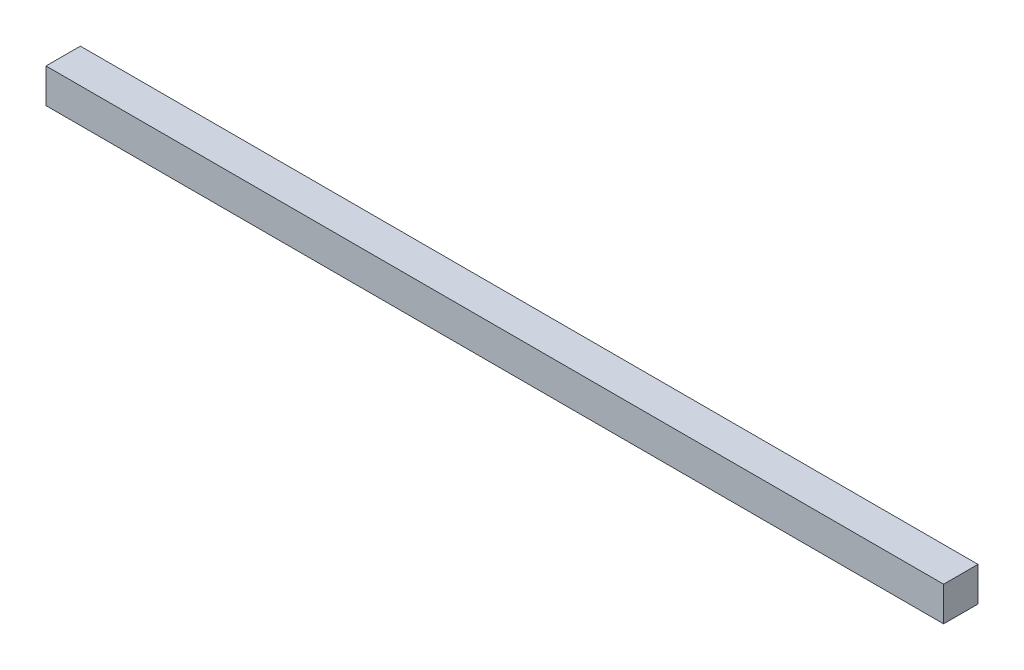
ISO-10303-21;
HEADER;
FILE_DESCRIPTION(('STEP AP214'),'2;1');
FILE_NAME('part.step','',(''),(''),'','','');
FILE_SCHEMA(('AUTOMOTIVE_DESIGN { 1 0 10303 214 1 1 1 1 }'));
ENDSEC;
DATA;
#1=APPLICATION_CONTEXT('core data for automotive mechanical design processes');
#2=APPLICATION_PROTOCOL_DEFINITION('international standard','automotive_design',2000,#1);
#3=PRODUCT_CONTEXT('',#1,'mechanical');
#4=PRODUCT('Part','Part','',(#3));
#5=PRODUCT_RELATED_PRODUCT_CATEGORY('part','',(#4));
#6=PRODUCT_DEFINITION_FORMATION('','',#4);
#7=PRODUCT_DEFINITION_CONTEXT('part definition',#1,'design');
#8=PRODUCT_DEFINITION('design','',#6,#7);
#9=PRODUCT_DEFINITION_SHAPE('','',#8);
#10=(LENGTH_UNIT() NAMED_UNIT(*) SI_UNIT(.MILLI.,.METRE.));
#11=(NAMED_UNIT(*) PLANE_ANGLE_UNIT() SI_UNIT($,.RADIAN.));
#12=(NAMED_UNIT(*) SI_UNIT($,.STERADIAN.) SOLID_ANGLE_UNIT());
#13=UNCERTAINTY_MEASURE_WITH_UNIT(LENGTH_MEASURE(1.E-05),#10,'distance_accuracy_value','');
#14=(GEOMETRIC_REPRESENTATION_CONTEXT(3) GLOBAL_UNCERTAINTY_ASSIGNED_CONTEXT((#13)) GLOBAL_UNIT_ASSIGNED_CONTEXT((#10,
#11,#12)) REPRESENTATION_CONTEXT('',''));
#15=CARTESIAN_POINT('',(0.,0.,0.));
#16=DIRECTION('',(0.,0.,1.));
#17=DIRECTION('',(1.,0.,0.));
#18=AXIS2_PLACEMENT_3D('',#15,#16,#17);
#19=CARTESIAN_POINT('',(117.5,-4.5,-4.5));
#20=DIRECTION('',(0.,0.,1.));
#21=DIRECTION('',(1.,0.,0.));
#22=AXIS2_PLACEMENT_3D('',#19,#20,#21);
#23=PLANE('',#22);
#24=DIRECTION('',(-1.,0.,0.));
#25=VECTOR('',#24,1.);
#26=CARTESIAN_POINT('',(117.5,-4.5,-4.5));
#27=LINE('',#26,#25);
#28=CARTESIAN_POINT('',(117.5,-4.5,-4.5));
#29=VERTEX_POINT('',#28);
#30=CARTESIAN_POINT('',(-117.5,-4.5,-4.5));
#31=VERTEX_POINT('',#30);
#32=EDGE_CURVE('E90',#29,#31,#27,.T.);
#33=ORIENTED_EDGE('',*,*,#32,.T.);
#34=DIRECTION('',(0.,1.,0.));
#35=VECTOR('',#34,1.);
#36=CARTESIAN_POINT('',(-117.5,-4.5,-4.5));
#37=LINE('',#36,#35);
#38=CARTESIAN_POINT('',(-117.5,4.5,-4.5));
#39=VERTEX_POINT('',#38);
#40=EDGE_CURVE('E85',#31,#39,#37,.T.);
#41=ORIENTED_EDGE('',*,*,#40,.T.);
#42=DIRECTION('',(-1.,0.,0.));
#43=VECTOR('',#42,1.);
#44=CARTESIAN_POINT('',(117.5,4.5,-4.5));
#45=LINE('',#44,#43);
#46=CARTESIAN_POINT('',(117.5,4.5,-4.5));
#47=VERTEX_POINT('',#46);
#48=EDGE_CURVE('E11',#47,#39,#45,.T.);
#49=ORIENTED_EDGE('',*,*,#48,.F.);
#50=DIRECTION('',(0.,1.,0.));
#51=VECTOR('',#50,1.);
#52=CARTESIAN_POINT('',(117.5,-4.5,-4.5));
#53=LINE('',#52,#51);
#54=EDGE_CURVE('E96',#29,#47,#53,.T.);
#55=ORIENTED_EDGE('',*,*,#54,.F.);
#56=EDGE_LOOP('',(#33,#41,#49,#55));
#57=FACE_BOUND('',#56,.T.);
#58=ADVANCED_FACE('F33',(#57),#23,.F.);
#59=CARTESIAN_POINT('',(117.5,4.5,4.5));
#60=DIRECTION('',(0.,-1.,0.));
#61=DIRECTION('',(0.,0.,-1.));
#62=AXIS2_PLACEMENT_3D('',#59,#60,#61);
#63=PLANE('',#62);
#64=ORIENTED_EDGE('',*,*,#48,.T.);
#65=DIRECTION('',(0.,0.,1.));
#66=VECTOR('',#65,1.);
#67=CARTESIAN_POINT('',(-117.5,4.5,4.5));
#68=LINE('',#67,#66);
#69=CARTESIAN_POINT('',(-117.5,4.5,4.5));
#70=VERTEX_POINT('',#69);
#71=EDGE_CURVE('E75',#39,#70,#68,.T.);
#72=ORIENTED_EDGE('',*,*,#71,.T.);
#73=DIRECTION('',(-1.,0.,0.));
#74=VECTOR('',#73,1.);
#75=CARTESIAN_POINT('',(117.5,4.5,4.5));
#76=LINE('',#75,#74);
#77=CARTESIAN_POINT('',(117.5,4.5,4.5));
#78=VERTEX_POINT('',#77);
#79=EDGE_CURVE('E40',#78,#70,#76,.T.);
#80=ORIENTED_EDGE('',*,*,#79,.F.);
#81=DIRECTION('',(0.,0.,1.));
#82=VECTOR('',#81,1.);
#83=CARTESIAN_POINT('',(117.5,4.5,4.5));
#84=LINE('',#83,#82);
#85=EDGE_CURVE('E76',#47,#78,#84,.T.);
#86=ORIENTED_EDGE('',*,*,#85,.F.);
#87=EDGE_LOOP('',(#64,#72,#80,#86));
#88=FACE_BOUND('',#87,.T.);
#89=ADVANCED_FACE('F73',(#88),#63,.F.);
#90=CARTESIAN_POINT('',(117.5,-4.5,4.5));
#91=DIRECTION('',(0.,0.,-1.));
#92=DIRECTION('',(-1.,0.,0.));
#93=AXIS2_PLACEMENT_3D('',#90,#91,#92);
#94=PLANE('',#93);
#95=ORIENTED_EDGE('',*,*,#79,.T.);
#96=DIRECTION('',(0.,-1.,0.));
#97=VECTOR('',#96,1.);
#98=CARTESIAN_POINT('',(-117.5,-4.5,4.5));
#99=LINE('',#98,#97);
#100=CARTESIAN_POINT('',(-117.5,-4.5,4.5));
#101=VERTEX_POINT('',#100);
#102=EDGE_CURVE('E88',#70,#101,#99,.T.);
#103=ORIENTED_EDGE('',*,*,#102,.T.);
#104=DIRECTION('',(-1.,0.,0.));
#105=VECTOR('',#104,1.);
#106=CARTESIAN_POINT('',(117.5,-4.5,4.5));
#107=LINE('',#106,#105);
#108=CARTESIAN_POINT('',(117.5,-4.5,4.5));
#109=VERTEX_POINT('',#108);
#110=EDGE_CURVE('E102',#109,#101,#107,.T.);
#111=ORIENTED_EDGE('',*,*,#110,.F.);
#112=DIRECTION('',(0.,-1.,0.));
#113=VECTOR('',#112,1.);
#114=CARTESIAN_POINT('',(117.5,-4.5,4.5));
#115=LINE('',#114,#113);
#116=EDGE_CURVE('E52',#78,#109,#115,.T.);
#117=ORIENTED_EDGE('',*,*,#116,.F.);
#118=EDGE_LOOP('',(#95,#103,#111,#117));
#119=FACE_BOUND('',#118,.T.);
#120=ADVANCED_FACE('F104',(#119),#94,.F.);
#121=CARTESIAN_POINT('',(117.5,-4.5,4.5));
#122=DIRECTION('',(0.,1.,0.));
#123=DIRECTION('',(0.,0.,1.));
#124=AXIS2_PLACEMENT_3D('',#121,#122,#123);
#125=PLANE('',#124);
#126=ORIENTED_EDGE('',*,*,#110,.T.);
#127=DIRECTION('',(0.,0.,-1.));
#128=VECTOR('',#127,1.);
#129=CARTESIAN_POINT('',(-117.5,-4.5,4.5));
#130=LINE('',#129,#128);
#131=EDGE_CURVE('E94',#101,#31,#130,.T.);
#132=ORIENTED_EDGE('',*,*,#131,.T.);
#133=ORIENTED_EDGE('',*,*,#32,.F.);
#134=DIRECTION('',(0.,0.,-1.));
#135=VECTOR('',#134,1.);
#136=CARTESIAN_POINT('',(117.5,-4.5,4.5));
#137=LINE('',#136,#135);
#138=EDGE_CURVE('E47',#109,#29,#137,.T.);
#139=ORIENTED_EDGE('',*,*,#138,.F.);
#140=EDGE_LOOP('',(#126,#132,#133,#139));
#141=FACE_BOUND('',#140,.T.);
#142=ADVANCED_FACE('F106',(#141),#125,.F.);
#143=CARTESIAN_POINT('',(117.5,0.,0.));
#144=DIRECTION('',(-1.,0.,0.));
#145=DIRECTION('',(0.,0.,1.));
#146=AXIS2_PLACEMENT_3D('',#143,#144,#145);
#147=PLANE('',#146);
#148=ORIENTED_EDGE('',*,*,#54,.T.);
#149=ORIENTED_EDGE('',*,*,#85,.T.);
#150=ORIENTED_EDGE('',*,*,#116,.T.);
#151=ORIENTED_EDGE('',*,*,#138,.T.);
#152=EDGE_LOOP('',(#148,#149,#150,#151));
#153=FACE_BOUND('',#152,.T.);
#154=ADVANCED_FACE('F107',(#153),#147,.F.);
#155=CARTESIAN_POINT('',(-117.5,0.,0.));
#156=DIRECTION('',(-1.,0.,0.));
#157=DIRECTION('',(0.,0.,1.));
#158=AXIS2_PLACEMENT_3D('',#155,#156,#157);
#159=PLANE('',#158);
#160=ORIENTED_EDGE('',*,*,#40,.F.);
#161=ORIENTED_EDGE('',*,*,#131,.F.);
#162=ORIENTED_EDGE('',*,*,#102,.F.);
#163=ORIENTED_EDGE('',*,*,#71,.F.);
#164=EDGE_LOOP('',(#160,#161,#162,#163));
#165=FACE_BOUND('',#164,.T.);
#166=ADVANCED_FACE('F83',(#165),#159,.T.);
#167=CLOSED_SHELL('',(#58,#89,#120,#142,#154,#166));
#168=MANIFOLD_SOLID_BREP('B2',#167);
#169=ADVANCED_BREP_SHAPE_REPRESENTATION('',(#18,#168),#14);
#170=SHAPE_DEFINITION_REPRESENTATION(#9,#169);
ENDSEC;
END-ISO-10303-21;
